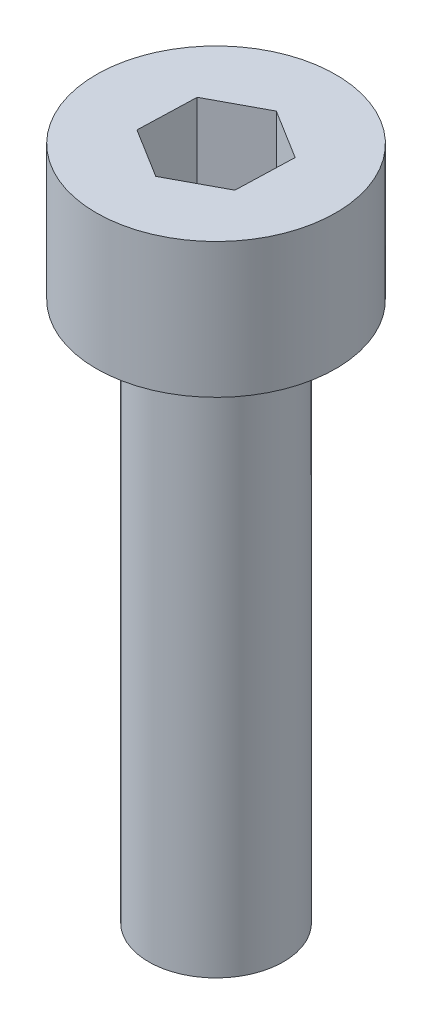
ISO-10303-21;
HEADER;
FILE_DESCRIPTION(('STEP AP214'),'2;1');
FILE_NAME('part.step','',(''),(''),'','','');
FILE_SCHEMA(('AUTOMOTIVE_DESIGN { 1 0 10303 214 1 1 1 1 }'));
ENDSEC;
DATA;
#1=APPLICATION_CONTEXT('core data for automotive mechanical design processes');
#2=APPLICATION_PROTOCOL_DEFINITION('international standard','automotive_design',2000,#1);
#3=PRODUCT_CONTEXT('',#1,'mechanical');
#4=PRODUCT('Part','Part','',(#3));
#5=PRODUCT_RELATED_PRODUCT_CATEGORY('part','',(#4));
#6=PRODUCT_DEFINITION_FORMATION('','',#4);
#7=PRODUCT_DEFINITION_CONTEXT('part definition',#1,'design');
#8=PRODUCT_DEFINITION('design','',#6,#7);
#9=PRODUCT_DEFINITION_SHAPE('','',#8);
#10=(LENGTH_UNIT() NAMED_UNIT(*) SI_UNIT(.MILLI.,.METRE.));
#11=(NAMED_UNIT(*) PLANE_ANGLE_UNIT() SI_UNIT($,.RADIAN.));
#12=(NAMED_UNIT(*) SI_UNIT($,.STERADIAN.) SOLID_ANGLE_UNIT());
#13=UNCERTAINTY_MEASURE_WITH_UNIT(LENGTH_MEASURE(1.E-05),#10,'distance_accuracy_value','');
#14=(GEOMETRIC_REPRESENTATION_CONTEXT(3) GLOBAL_UNCERTAINTY_ASSIGNED_CONTEXT((#13)) GLOBAL_UNIT_ASSIGNED_CONTEXT((#10,
#11,#12)) REPRESENTATION_CONTEXT('',''));
#15=CARTESIAN_POINT('',(0.,0.,0.));
#16=DIRECTION('',(0.,0.,1.));
#17=DIRECTION('',(1.,0.,0.));
#18=AXIS2_PLACEMENT_3D('',#15,#16,#17);
#19=CARTESIAN_POINT('',(0.,4.,0.));
#20=DIRECTION('',(0.,-1.,0.));
#21=DIRECTION('',(0.,0.,-1.));
#22=AXIS2_PLACEMENT_3D('',#19,#20,#21);
#23=CYLINDRICAL_SURFACE('',#22,3.55);
#24=CARTESIAN_POINT('',(0.,4.,0.));
#25=DIRECTION('',(0.,1.,0.));
#26=DIRECTION('',(0.,0.,1.));
#27=AXIS2_PLACEMENT_3D('',#24,#25,#26);
#28=CIRCLE('',#27,3.55);
#29=CARTESIAN_POINT('',(0.,4.,3.55));
#30=VERTEX_POINT('',#29);
#31=EDGE_CURVE('E44',#30,#30,#28,.T.);
#32=ORIENTED_EDGE('',*,*,#31,.F.);
#33=EDGE_LOOP('',(#32));
#34=FACE_BOUND('',#33,.T.);
#35=CARTESIAN_POINT('',(0.,0.,0.));
#36=DIRECTION('',(0.,1.,0.));
#37=DIRECTION('',(0.,0.,1.));
#38=AXIS2_PLACEMENT_3D('',#35,#36,#37);
#39=CIRCLE('',#38,3.55);
#40=CARTESIAN_POINT('',(0.,0.,3.55));
#41=VERTEX_POINT('',#40);
#42=EDGE_CURVE('E39',#41,#41,#39,.T.);
#43=ORIENTED_EDGE('',*,*,#42,.T.);
#44=EDGE_LOOP('',(#43));
#45=FACE_BOUND('',#44,.T.);
#46=ADVANCED_FACE('F36',(#34,#45),#23,.T.);
#47=CARTESIAN_POINT('',(0.,4.,0.));
#48=DIRECTION('',(0.,1.,0.));
#49=DIRECTION('',(0.,0.,1.));
#50=AXIS2_PLACEMENT_3D('',#47,#48,#49);
#51=PLANE('',#50);
#52=DIRECTION('',(-0.849665122348572,0.,-0.527322652523468));
#53=VECTOR('',#52,1.);
#54=CARTESIAN_POINT('',(1.52681555944868,4.,-0.817822870446541));
#55=LINE('',#54,#53);
#56=CARTESIAN_POINT('',(1.52681555944868,4.,-0.817822870446541));
#57=VERTEX_POINT('',#56);
#58=CARTESIAN_POINT('',(0.0551523981217248,4.,-1.73117249659918));
#59=VERTEX_POINT('',#58);
#60=EDGE_CURVE('E52',#57,#59,#55,.T.);
#61=ORIENTED_EDGE('',*,*,#60,.F.);
#62=DIRECTION('',(0.031842251902031,0.,-0.999492906925211));
#63=VECTOR('',#62,1.);
#64=CARTESIAN_POINT('',(1.47166316132695,4.,0.913349626152634));
#65=LINE('',#64,#63);
#66=CARTESIAN_POINT('',(1.47166316132695,4.,0.913349626152634));
#67=VERTEX_POINT('',#66);
#68=EDGE_CURVE('E135',#67,#57,#65,.T.);
#69=ORIENTED_EDGE('',*,*,#68,.F.);
#70=DIRECTION('',(0.881507374250603,0.,-0.472170254401743));
#71=VECTOR('',#70,1.);
#72=CARTESIAN_POINT('',(-0.0551523981217241,4.,1.73117249659918));
#73=LINE('',#72,#71);
#74=CARTESIAN_POINT('',(-0.0551523981217241,4.,1.73117249659918));
#75=VERTEX_POINT('',#74);
#76=EDGE_CURVE('E133',#75,#67,#73,.T.);
#77=ORIENTED_EDGE('',*,*,#76,.F.);
#78=DIRECTION('',(0.849665122348572,0.,0.527322652523467));
#79=VECTOR('',#78,1.);
#80=CARTESIAN_POINT('',(-1.52681555944868,4.,0.817822870446541));
#81=LINE('',#80,#79);
#82=CARTESIAN_POINT('',(-1.52681555944868,4.,0.817822870446541));
#83=VERTEX_POINT('',#82);
#84=EDGE_CURVE('E100',#83,#75,#81,.T.);
#85=ORIENTED_EDGE('',*,*,#84,.F.);
#86=DIRECTION('',(-0.0318422519020308,0.,0.999492906925211));
#87=VECTOR('',#86,1.);
#88=CARTESIAN_POINT('',(-1.47166316132695,4.,-0.913349626152635));
#89=LINE('',#88,#87);
#90=CARTESIAN_POINT('',(-1.47166316132695,4.,-0.913349626152635));
#91=VERTEX_POINT('',#90);
#92=EDGE_CURVE('E129',#91,#83,#89,.T.);
#93=ORIENTED_EDGE('',*,*,#92,.F.);
#94=DIRECTION('',(-0.881507374250603,0.,0.472170254401743));
#95=VECTOR('',#94,1.);
#96=CARTESIAN_POINT('',(0.0551523981217247,4.,-1.73117249659918));
#97=LINE('',#96,#95);
#98=EDGE_CURVE('E126',#59,#91,#97,.T.);
#99=ORIENTED_EDGE('',*,*,#98,.F.);
#100=EDGE_LOOP('',(#61,#69,#77,#85,#93,#99));
#101=FACE_BOUND('',#100,.T.);
#102=ORIENTED_EDGE('',*,*,#31,.T.);
#103=EDGE_LOOP('',(#102));
#104=FACE_BOUND('',#103,.T.);
#105=ADVANCED_FACE('F156',(#101,#104),#51,.T.);
#106=CARTESIAN_POINT('',(0.,0.,0.));
#107=DIRECTION('',(0.,1.,0.));
#108=DIRECTION('',(0.,0.,1.));
#109=AXIS2_PLACEMENT_3D('',#106,#107,#108);
#110=PLANE('',#109);
#111=CARTESIAN_POINT('',(0.,0.,0.));
#112=DIRECTION('',(0.,-1.,0.));
#113=DIRECTION('',(0.,0.,-1.));
#114=AXIS2_PLACEMENT_3D('',#111,#112,#113);
#115=CIRCLE('',#114,2.);
#116=CARTESIAN_POINT('',(0.,0.,-2.));
#117=VERTEX_POINT('',#116);
#118=EDGE_CURVE('E11',#117,#117,#115,.T.);
#119=ORIENTED_EDGE('',*,*,#118,.F.);
#120=EDGE_LOOP('',(#119));
#121=FACE_BOUND('',#120,.T.);
#122=ORIENTED_EDGE('',*,*,#42,.F.);
#123=EDGE_LOOP('',(#122));
#124=FACE_BOUND('',#123,.T.);
#125=ADVANCED_FACE('F153',(#121,#124),#110,.F.);
#126=CARTESIAN_POINT('',(0.,-16.,0.));
#127=DIRECTION('',(0.,1.,0.));
#128=DIRECTION('',(0.,0.,1.));
#129=AXIS2_PLACEMENT_3D('',#126,#127,#128);
#130=CYLINDRICAL_SURFACE('',#129,2.);
#131=CARTESIAN_POINT('',(0.,-16.,0.));
#132=DIRECTION('',(0.,-1.,0.));
#133=DIRECTION('',(0.,0.,-1.));
#134=AXIS2_PLACEMENT_3D('',#131,#132,#133);
#135=CIRCLE('',#134,2.);
#136=CARTESIAN_POINT('',(0.,-16.,-2.));
#137=VERTEX_POINT('',#136);
#138=EDGE_CURVE('E139',#137,#137,#135,.T.);
#139=ORIENTED_EDGE('',*,*,#138,.F.);
#140=EDGE_LOOP('',(#139));
#141=FACE_BOUND('',#140,.T.);
#142=ORIENTED_EDGE('',*,*,#118,.T.);
#143=EDGE_LOOP('',(#142));
#144=FACE_BOUND('',#143,.T.);
#145=ADVANCED_FACE('F155',(#141,#144),#130,.T.);
#146=CARTESIAN_POINT('',(0.,-16.,0.));
#147=DIRECTION('',(0.,-1.,0.));
#148=DIRECTION('',(0.,0.,-1.));
#149=AXIS2_PLACEMENT_3D('',#146,#147,#148);
#150=PLANE('',#149);
#151=ORIENTED_EDGE('',*,*,#138,.T.);
#152=EDGE_LOOP('',(#151));
#153=FACE_BOUND('',#152,.T.);
#154=ADVANCED_FACE('F162',(#153),#150,.T.);
#155=CARTESIAN_POINT('',(1.52681555944868,1.,-0.817822870446541));
#156=DIRECTION('',(0.527322652523468,0.,-0.849665122348572));
#157=DIRECTION('',(-0.849665122348572,0.,-0.527322652523468));
#158=AXIS2_PLACEMENT_3D('',#155,#156,#157);
#159=PLANE('',#158);
#160=ORIENTED_EDGE('',*,*,#60,.T.);
#161=DIRECTION('',(0.,1.,0.));
#162=VECTOR('',#161,1.);
#163=CARTESIAN_POINT('',(0.0551523981217247,1.,-1.73117249659918));
#164=LINE('',#163,#162);
#165=CARTESIAN_POINT('',(0.0551523981217247,1.,-1.73117249659918));
#166=VERTEX_POINT('',#165);
#167=EDGE_CURVE('E82',#166,#59,#164,.T.);
#168=ORIENTED_EDGE('',*,*,#167,.F.);
#169=DIRECTION('',(-0.849665122348572,0.,-0.527322652523468));
#170=VECTOR('',#169,1.);
#171=CARTESIAN_POINT('',(1.52681555944868,1.,-0.817822870446541));
#172=LINE('',#171,#170);
#173=CARTESIAN_POINT('',(1.52681555944868,1.,-0.817822870446541));
#174=VERTEX_POINT('',#173);
#175=EDGE_CURVE('E137',#174,#166,#172,.T.);
#176=ORIENTED_EDGE('',*,*,#175,.F.);
#177=DIRECTION('',(0.,1.,0.));
#178=VECTOR('',#177,1.);
#179=CARTESIAN_POINT('',(1.52681555944868,1.,-0.817822870446541));
#180=LINE('',#179,#178);
#181=EDGE_CURVE('E60',#174,#57,#180,.T.);
#182=ORIENTED_EDGE('',*,*,#181,.T.);
#183=EDGE_LOOP('',(#160,#168,#176,#182));
#184=FACE_BOUND('',#183,.T.);
#185=ADVANCED_FACE('F187',(#184),#159,.F.);
#186=CARTESIAN_POINT('',(1.47166316132695,1.,0.913349626152634));
#187=DIRECTION('',(0.99949290692521,0.,0.031842251902031));
#188=DIRECTION('',(0.031842251902031,0.,-0.999492906925211));
#189=AXIS2_PLACEMENT_3D('',#186,#187,#188);
#190=PLANE('',#189);
#191=ORIENTED_EDGE('',*,*,#68,.T.);
#192=ORIENTED_EDGE('',*,*,#181,.F.);
#193=DIRECTION('',(0.031842251902031,0.,-0.999492906925211));
#194=VECTOR('',#193,1.);
#195=CARTESIAN_POINT('',(1.47166316132695,1.,0.913349626152634));
#196=LINE('',#195,#194);
#197=CARTESIAN_POINT('',(1.47166316132695,1.,0.913349626152634));
#198=VERTEX_POINT('',#197);
#199=EDGE_CURVE('E112',#198,#174,#196,.T.);
#200=ORIENTED_EDGE('',*,*,#199,.F.);
#201=DIRECTION('',(0.,1.,0.));
#202=VECTOR('',#201,1.);
#203=CARTESIAN_POINT('',(1.47166316132695,1.,0.913349626152634));
#204=LINE('',#203,#202);
#205=EDGE_CURVE('E104',#198,#67,#204,.T.);
#206=ORIENTED_EDGE('',*,*,#205,.T.);
#207=EDGE_LOOP('',(#191,#192,#200,#206));
#208=FACE_BOUND('',#207,.T.);
#209=ADVANCED_FACE('F192',(#208),#190,.F.);
#210=CARTESIAN_POINT('',(-0.0551523981217241,1.,1.73117249659918));
#211=DIRECTION('',(0.472170254401743,0.,0.881507374250603));
#212=DIRECTION('',(0.881507374250604,0.,-0.472170254401743));
#213=AXIS2_PLACEMENT_3D('',#210,#211,#212);
#214=PLANE('',#213);
#215=ORIENTED_EDGE('',*,*,#76,.T.);
#216=ORIENTED_EDGE('',*,*,#205,.F.);
#217=DIRECTION('',(0.881507374250603,0.,-0.472170254401743));
#218=VECTOR('',#217,1.);
#219=CARTESIAN_POINT('',(-0.0551523981217241,1.,1.73117249659918));
#220=LINE('',#219,#218);
#221=CARTESIAN_POINT('',(-0.0551523981217241,1.,1.73117249659918));
#222=VERTEX_POINT('',#221);
#223=EDGE_CURVE('E108',#222,#198,#220,.T.);
#224=ORIENTED_EDGE('',*,*,#223,.F.);
#225=DIRECTION('',(0.,1.,0.));
#226=VECTOR('',#225,1.);
#227=CARTESIAN_POINT('',(-0.0551523981217241,1.,1.73117249659918));
#228=LINE('',#227,#226);
#229=EDGE_CURVE('E93',#222,#75,#228,.T.);
#230=ORIENTED_EDGE('',*,*,#229,.T.);
#231=EDGE_LOOP('',(#215,#216,#224,#230));
#232=FACE_BOUND('',#231,.T.);
#233=ADVANCED_FACE('F109',(#232),#214,.F.);
#234=CARTESIAN_POINT('',(-1.52681555944868,1.,0.817822870446541));
#235=DIRECTION('',(-0.527322652523468,0.,0.849665122348572));
#236=DIRECTION('',(0.849665122348572,0.,0.527322652523468));
#237=AXIS2_PLACEMENT_3D('',#234,#235,#236);
#238=PLANE('',#237);
#239=ORIENTED_EDGE('',*,*,#84,.T.);
#240=ORIENTED_EDGE('',*,*,#229,.F.);
#241=DIRECTION('',(0.849665122348572,0.,0.527322652523467));
#242=VECTOR('',#241,1.);
#243=CARTESIAN_POINT('',(-1.52681555944868,1.,0.817822870446541));
#244=LINE('',#243,#242);
#245=CARTESIAN_POINT('',(-1.52681555944868,1.,0.817822870446541));
#246=VERTEX_POINT('',#245);
#247=EDGE_CURVE('E97',#246,#222,#244,.T.);
#248=ORIENTED_EDGE('',*,*,#247,.F.);
#249=DIRECTION('',(0.,1.,0.));
#250=VECTOR('',#249,1.);
#251=CARTESIAN_POINT('',(-1.52681555944868,1.,0.817822870446541));
#252=LINE('',#251,#250);
#253=EDGE_CURVE('E105',#246,#83,#252,.T.);
#254=ORIENTED_EDGE('',*,*,#253,.T.);
#255=EDGE_LOOP('',(#239,#240,#248,#254));
#256=FACE_BOUND('',#255,.T.);
#257=ADVANCED_FACE('F95',(#256),#238,.F.);
#258=CARTESIAN_POINT('',(-1.47166316132695,1.,-0.913349626152635));
#259=DIRECTION('',(-0.999492906925211,0.,-0.0318422519020308));
#260=DIRECTION('',(-0.0318422519020308,0.,0.999492906925211));
#261=AXIS2_PLACEMENT_3D('',#258,#259,#260);
#262=PLANE('',#261);
#263=ORIENTED_EDGE('',*,*,#92,.T.);
#264=ORIENTED_EDGE('',*,*,#253,.F.);
#265=DIRECTION('',(-0.0318422519020308,0.,0.999492906925211));
#266=VECTOR('',#265,1.);
#267=CARTESIAN_POINT('',(-1.47166316132695,1.,-0.913349626152635));
#268=LINE('',#267,#266);
#269=CARTESIAN_POINT('',(-1.47166316132695,1.,-0.913349626152635));
#270=VERTEX_POINT('',#269);
#271=EDGE_CURVE('E118',#270,#246,#268,.T.);
#272=ORIENTED_EDGE('',*,*,#271,.F.);
#273=DIRECTION('',(0.,1.,0.));
#274=VECTOR('',#273,1.);
#275=CARTESIAN_POINT('',(-1.47166316132695,1.,-0.913349626152635));
#276=LINE('',#275,#274);
#277=EDGE_CURVE('E142',#270,#91,#276,.T.);
#278=ORIENTED_EDGE('',*,*,#277,.T.);
#279=EDGE_LOOP('',(#263,#264,#272,#278));
#280=FACE_BOUND('',#279,.T.);
#281=ADVANCED_FACE('F217',(#280),#262,.F.);
#282=CARTESIAN_POINT('',(0.0551523981217247,1.,-1.73117249659918));
#283=DIRECTION('',(-0.472170254401743,0.,-0.881507374250603));
#284=DIRECTION('',(-0.881507374250603,0.,0.472170254401743));
#285=AXIS2_PLACEMENT_3D('',#282,#283,#284);
#286=PLANE('',#285);
#287=ORIENTED_EDGE('',*,*,#98,.T.);
#288=ORIENTED_EDGE('',*,*,#277,.F.);
#289=DIRECTION('',(-0.881507374250603,0.,0.472170254401743));
#290=VECTOR('',#289,1.);
#291=CARTESIAN_POINT('',(0.0551523981217247,1.,-1.73117249659918));
#292=LINE('',#291,#290);
#293=EDGE_CURVE('E120',#166,#270,#292,.T.);
#294=ORIENTED_EDGE('',*,*,#293,.F.);
#295=ORIENTED_EDGE('',*,*,#167,.T.);
#296=EDGE_LOOP('',(#287,#288,#294,#295));
#297=FACE_BOUND('',#296,.T.);
#298=ADVANCED_FACE('F226',(#297),#286,.F.);
#299=CARTESIAN_POINT('',(0.,1.,0.));
#300=DIRECTION('',(0.,1.,0.));
#301=DIRECTION('',(0.,0.,1.));
#302=AXIS2_PLACEMENT_3D('',#299,#300,#301);
#303=PLANE('',#302);
#304=ORIENTED_EDGE('',*,*,#175,.T.);
#305=ORIENTED_EDGE('',*,*,#293,.T.);
#306=ORIENTED_EDGE('',*,*,#271,.T.);
#307=ORIENTED_EDGE('',*,*,#247,.T.);
#308=ORIENTED_EDGE('',*,*,#223,.T.);
#309=ORIENTED_EDGE('',*,*,#199,.T.);
#310=EDGE_LOOP('',(#304,#305,#306,#307,#308,#309));
#311=FACE_BOUND('',#310,.T.);
#312=ADVANCED_FACE('F115',(#311),#303,.T.);
#313=CLOSED_SHELL('',(#46,#105,#125,#145,#154,#185,#209,#233,#257,#281,#298,#312));
#314=MANIFOLD_SOLID_BREP('B2',#313);
#315=ADVANCED_BREP_SHAPE_REPRESENTATION('',(#18,#314),#14);
#316=SHAPE_DEFINITION_REPRESENTATION(#9,#315);
ENDSEC;
END-ISO-10303-21;
